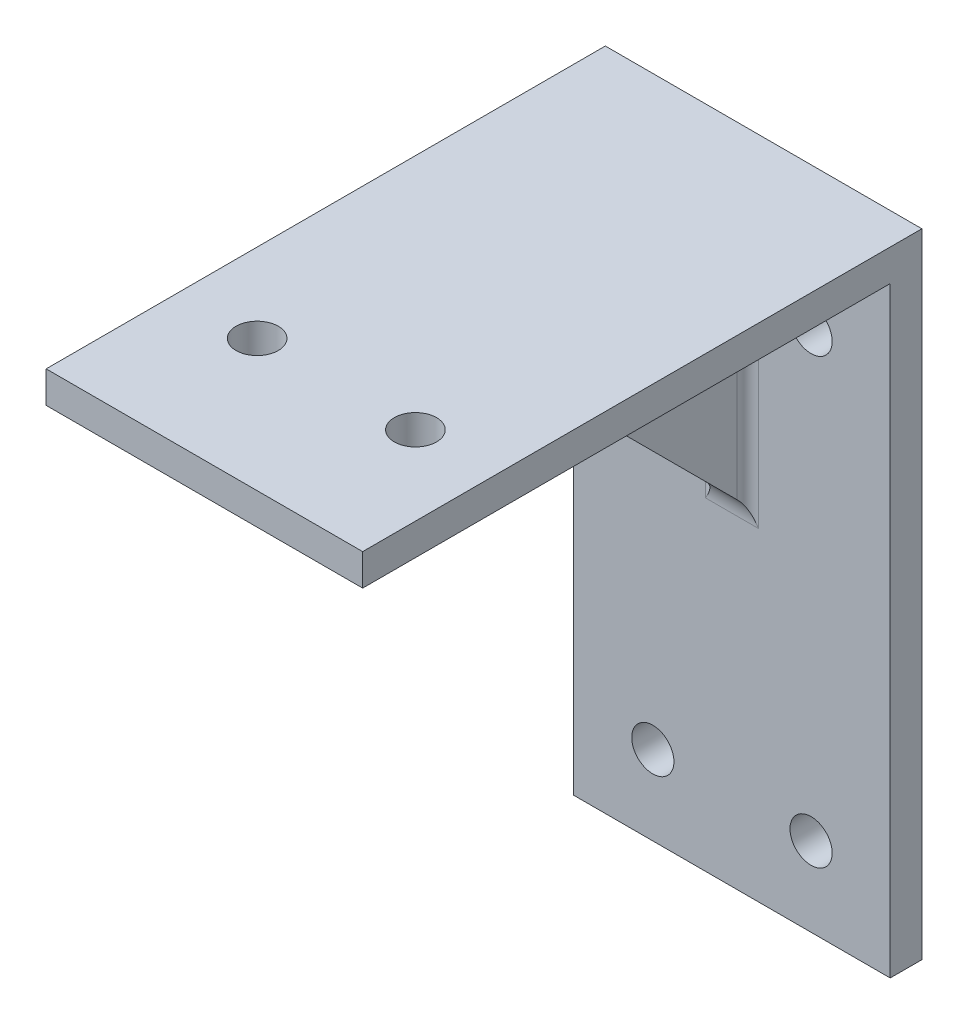
ISO-10303-21;
HEADER;
FILE_DESCRIPTION(('STEP AP214'),'2;1');
FILE_NAME('part.step','',(''),(''),'','','');
FILE_SCHEMA(('AUTOMOTIVE_DESIGN { 1 0 10303 214 1 1 1 1 }'));
ENDSEC;
DATA;
#1=APPLICATION_CONTEXT('core data for automotive mechanical design processes');
#2=APPLICATION_PROTOCOL_DEFINITION('international standard','automotive_design',2000,#1);
#3=PRODUCT_CONTEXT('',#1,'mechanical');
#4=PRODUCT('Part','Part','',(#3));
#5=PRODUCT_RELATED_PRODUCT_CATEGORY('part','',(#4));
#6=PRODUCT_DEFINITION_FORMATION('','',#4);
#7=PRODUCT_DEFINITION_CONTEXT('part definition',#1,'design');
#8=PRODUCT_DEFINITION('design','',#6,#7);
#9=PRODUCT_DEFINITION_SHAPE('','',#8);
#10=(LENGTH_UNIT() NAMED_UNIT(*) SI_UNIT(.MILLI.,.METRE.));
#11=(NAMED_UNIT(*) PLANE_ANGLE_UNIT() SI_UNIT($,.RADIAN.));
#12=(NAMED_UNIT(*) SI_UNIT($,.STERADIAN.) SOLID_ANGLE_UNIT());
#13=UNCERTAINTY_MEASURE_WITH_UNIT(LENGTH_MEASURE(1.E-05),#10,'distance_accuracy_value','');
#14=(GEOMETRIC_REPRESENTATION_CONTEXT(3) GLOBAL_UNCERTAINTY_ASSIGNED_CONTEXT((#13)) GLOBAL_UNIT_ASSIGNED_CONTEXT((#10,
#11,#12)) REPRESENTATION_CONTEXT('',''));
#15=CARTESIAN_POINT('',(0.,0.,0.));
#16=DIRECTION('',(0.,0.,1.));
#17=DIRECTION('',(1.,0.,0.));
#18=AXIS2_PLACEMENT_3D('',#15,#16,#17);
#19=CARTESIAN_POINT('',(0.,0.,6.));
#20=DIRECTION('',(0.,0.,1.));
#21=DIRECTION('',(1.,0.,0.));
#22=AXIS2_PLACEMENT_3D('',#19,#20,#21);
#23=PLANE('',#22);
#24=CARTESIAN_POINT('',(15.,-45.,6.));
#25=DIRECTION('',(0.,0.,1.));
#26=DIRECTION('',(1.,0.,0.));
#27=AXIS2_PLACEMENT_3D('',#24,#25,#26);
#28=CIRCLE('',#27,4.);
#29=CARTESIAN_POINT('',(19.,-45.,6.));
#30=VERTEX_POINT('',#29);
#31=EDGE_CURVE('E4968',#30,#30,#28,.T.);
#32=ORIENTED_EDGE('',*,*,#31,.F.);
#33=EDGE_LOOP('',(#32));
#34=FACE_BOUND('',#33,.T.);
#35=CARTESIAN_POINT('',(-15.,39.,6.));
#36=DIRECTION('',(0.,0.,1.));
#37=DIRECTION('',(1.,0.,0.));
#38=AXIS2_PLACEMENT_3D('',#35,#36,#37);
#39=CIRCLE('',#38,4.);
#40=CARTESIAN_POINT('',(-11.,39.,6.));
#41=VERTEX_POINT('',#40);
#42=EDGE_CURVE('E4970',#41,#41,#39,.T.);
#43=ORIENTED_EDGE('',*,*,#42,.F.);
#44=EDGE_LOOP('',(#43));
#45=FACE_BOUND('',#44,.T.);
#46=CARTESIAN_POINT('',(15.,39.,6.));
#47=DIRECTION('',(0.,0.,1.));
#48=DIRECTION('',(1.,0.,0.));
#49=AXIS2_PLACEMENT_3D('',#46,#47,#48);
#50=CIRCLE('',#49,4.);
#51=CARTESIAN_POINT('',(19.,39.,6.));
#52=VERTEX_POINT('',#51);
#53=EDGE_CURVE('E4872',#52,#52,#50,.T.);
#54=ORIENTED_EDGE('',*,*,#53,.F.);
#55=EDGE_LOOP('',(#54));
#56=FACE_BOUND('',#55,.T.);
#57=CARTESIAN_POINT('',(-15.,-45.,6.));
#58=DIRECTION('',(0.,0.,1.));
#59=DIRECTION('',(1.,0.,0.));
#60=AXIS2_PLACEMENT_3D('',#57,#58,#59);
#61=CIRCLE('',#60,4.);
#62=CARTESIAN_POINT('',(-11.,-45.,6.));
#63=VERTEX_POINT('',#62);
#64=EDGE_CURVE('E4820',#63,#63,#61,.T.);
#65=ORIENTED_EDGE('',*,*,#64,.F.);
#66=EDGE_LOOP('',(#65));
#67=FACE_BOUND('',#66,.T.);
#68=DIRECTION('',(-1.,0.,0.));
#69=VECTOR('',#68,1.);
#70=CARTESIAN_POINT('',(0.,1.30761184457489,6.));
#71=LINE('',#70,#69);
#72=CARTESIAN_POINT('',(5.,1.30761184457489,6.));
#73=VERTEX_POINT('',#72);
#74=CARTESIAN_POINT('',(-5.,1.30761184457489,6.));
#75=VERTEX_POINT('',#74);
#76=EDGE_CURVE('E4870',#73,#75,#71,.T.);
#77=ORIENTED_EDGE('',*,*,#76,.T.);
#78=DIRECTION('',(0.,1.,0.));
#79=VECTOR('',#78,1.);
#80=CARTESIAN_POINT('',(-5.,54.,6.));
#81=LINE('',#80,#79);
#82=CARTESIAN_POINT('',(-5.,54.,6.));
#83=VERTEX_POINT('',#82);
#84=EDGE_CURVE('E4835',#75,#83,#81,.T.);
#85=ORIENTED_EDGE('',*,*,#84,.T.);
#86=DIRECTION('',(-1.,0.,0.));
#87=VECTOR('',#86,1.);
#88=CARTESIAN_POINT('',(30.,54.,6.));
#89=LINE('',#88,#87);
#90=CARTESIAN_POINT('',(-30.,54.,6.));
#91=VERTEX_POINT('',#90);
#92=EDGE_CURVE('E4759',#83,#91,#89,.T.);
#93=ORIENTED_EDGE('',*,*,#92,.T.);
#94=DIRECTION('',(0.,-1.,0.));
#95=VECTOR('',#94,1.);
#96=CARTESIAN_POINT('',(-30.,-60.,6.));
#97=LINE('',#96,#95);
#98=CARTESIAN_POINT('',(-30.,-60.,6.));
#99=VERTEX_POINT('',#98);
#100=EDGE_CURVE('E4746',#91,#99,#97,.T.);
#101=ORIENTED_EDGE('',*,*,#100,.T.);
#102=DIRECTION('',(1.,0.,0.));
#103=VECTOR('',#102,1.);
#104=CARTESIAN_POINT('',(-30.,-60.,6.));
#105=LINE('',#104,#103);
#106=CARTESIAN_POINT('',(30.,-60.,6.));
#107=VERTEX_POINT('',#106);
#108=EDGE_CURVE('E4767',#99,#107,#105,.T.);
#109=ORIENTED_EDGE('',*,*,#108,.T.);
#110=DIRECTION('',(0.,1.,0.));
#111=VECTOR('',#110,1.);
#112=CARTESIAN_POINT('',(30.,-60.,6.));
#113=LINE('',#112,#111);
#114=CARTESIAN_POINT('',(30.,54.,6.));
#115=VERTEX_POINT('',#114);
#116=EDGE_CURVE('E4775',#107,#115,#113,.T.);
#117=ORIENTED_EDGE('',*,*,#116,.T.);
#118=CARTESIAN_POINT('',(5.,54.,6.));
#119=VERTEX_POINT('',#118);
#120=EDGE_CURVE('E4732',#115,#119,#89,.T.);
#121=ORIENTED_EDGE('',*,*,#120,.T.);
#122=DIRECTION('',(0.,1.,0.));
#123=VECTOR('',#122,1.);
#124=CARTESIAN_POINT('',(5.,0.,6.));
#125=LINE('',#124,#123);
#126=EDGE_CURVE('E4805',#119,#73,#125,.F.);
#127=ORIENTED_EDGE('',*,*,#126,.T.);
#128=EDGE_LOOP('',(#77,#85,#93,#101,#109,#117,#121,#127));
#129=FACE_BOUND('',#128,.T.);
#130=ADVANCED_FACE('F4615',(#34,#45,#56,#67,#129),#23,.T.);
#131=CARTESIAN_POINT('',(-30.,60.,6.));
#132=DIRECTION('',(0.,-1.,0.));
#133=DIRECTION('',(1.,0.,0.));
#134=AXIS2_PLACEMENT_3D('',#131,#132,#133);
#135=PLANE('',#134);
#136=CARTESIAN_POINT('',(15.,60.,81.));
#137=DIRECTION('',(0.,1.,0.));
#138=DIRECTION('',(-1.,0.,0.));
#139=AXIS2_PLACEMENT_3D('',#136,#137,#138);
#140=CIRCLE('',#139,4.);
#141=CARTESIAN_POINT('',(11.,60.,81.));
#142=VERTEX_POINT('',#141);
#143=EDGE_CURVE('E4809',#142,#142,#140,.T.);
#144=ORIENTED_EDGE('',*,*,#143,.F.);
#145=EDGE_LOOP('',(#144));
#146=FACE_BOUND('',#145,.T.);
#147=CARTESIAN_POINT('',(-15.,60.,81.));
#148=DIRECTION('',(0.,1.,0.));
#149=DIRECTION('',(-1.,0.,0.));
#150=AXIS2_PLACEMENT_3D('',#147,#148,#149);
#151=CIRCLE('',#150,4.);
#152=CARTESIAN_POINT('',(-19.,60.,81.));
#153=VERTEX_POINT('',#152);
#154=EDGE_CURVE('E4826',#153,#153,#151,.T.);
#155=ORIENTED_EDGE('',*,*,#154,.F.);
#156=EDGE_LOOP('',(#155));
#157=FACE_BOUND('',#156,.T.);
#158=DIRECTION('',(-1.,0.,0.));
#159=VECTOR('',#158,1.);
#160=CARTESIAN_POINT('',(-30.,60.,0.));
#161=LINE('',#160,#159);
#162=CARTESIAN_POINT('',(30.,60.,0.));
#163=VERTEX_POINT('',#162);
#164=CARTESIAN_POINT('',(-30.,60.,0.));
#165=VERTEX_POINT('',#164);
#166=EDGE_CURVE('E4761',#163,#165,#161,.T.);
#167=ORIENTED_EDGE('',*,*,#166,.T.);
#168=DIRECTION('',(0.,0.,-1.));
#169=VECTOR('',#168,1.);
#170=CARTESIAN_POINT('',(-30.,60.,6.));
#171=LINE('',#170,#169);
#172=CARTESIAN_POINT('',(-30.,60.,106.));
#173=VERTEX_POINT('',#172);
#174=EDGE_CURVE('E4798',#173,#165,#171,.T.);
#175=ORIENTED_EDGE('',*,*,#174,.F.);
#176=DIRECTION('',(1.,0.,0.));
#177=VECTOR('',#176,1.);
#178=CARTESIAN_POINT('',(30.,60.,106.));
#179=LINE('',#178,#177);
#180=CARTESIAN_POINT('',(30.,60.,106.));
#181=VERTEX_POINT('',#180);
#182=EDGE_CURVE('E4730',#173,#181,#179,.T.);
#183=ORIENTED_EDGE('',*,*,#182,.T.);
#184=DIRECTION('',(0.,0.,-1.));
#185=VECTOR('',#184,1.);
#186=CARTESIAN_POINT('',(30.,60.,6.));
#187=LINE('',#186,#185);
#188=EDGE_CURVE('E4778',#181,#163,#187,.T.);
#189=ORIENTED_EDGE('',*,*,#188,.T.);
#190=EDGE_LOOP('',(#167,#175,#183,#189));
#191=FACE_BOUND('',#190,.T.);
#192=ADVANCED_FACE('F4915',(#146,#157,#191),#135,.F.);
#193=CARTESIAN_POINT('',(-30.,-60.,6.));
#194=DIRECTION('',(1.,0.,0.));
#195=DIRECTION('',(0.,0.,-1.));
#196=AXIS2_PLACEMENT_3D('',#193,#194,#195);
#197=PLANE('',#196);
#198=DIRECTION('',(0.,-1.,0.));
#199=VECTOR('',#198,1.);
#200=CARTESIAN_POINT('',(-30.,-60.,0.));
#201=LINE('',#200,#199);
#202=CARTESIAN_POINT('',(-30.,-60.,0.));
#203=VERTEX_POINT('',#202);
#204=EDGE_CURVE('E4779',#165,#203,#201,.T.);
#205=ORIENTED_EDGE('',*,*,#204,.T.);
#206=DIRECTION('',(0.,0.,-1.));
#207=VECTOR('',#206,1.);
#208=CARTESIAN_POINT('',(-30.,-60.,6.));
#209=LINE('',#208,#207);
#210=EDGE_CURVE('E4794',#99,#203,#209,.T.);
#211=ORIENTED_EDGE('',*,*,#210,.F.);
#212=ORIENTED_EDGE('',*,*,#100,.F.);
#213=DIRECTION('',(0.,0.,1.));
#214=VECTOR('',#213,1.);
#215=CARTESIAN_POINT('',(-30.,54.,106.));
#216=LINE('',#215,#214);
#217=CARTESIAN_POINT('',(-30.,54.,106.));
#218=VERTEX_POINT('',#217);
#219=EDGE_CURVE('E4739',#91,#218,#216,.T.);
#220=ORIENTED_EDGE('',*,*,#219,.T.);
#221=DIRECTION('',(0.,1.,0.));
#222=VECTOR('',#221,1.);
#223=CARTESIAN_POINT('',(-30.,54.,106.));
#224=LINE('',#223,#222);
#225=EDGE_CURVE('E4721',#218,#173,#224,.T.);
#226=ORIENTED_EDGE('',*,*,#225,.T.);
#227=ORIENTED_EDGE('',*,*,#174,.T.);
#228=EDGE_LOOP('',(#205,#211,#212,#220,#226,#227));
#229=FACE_BOUND('',#228,.T.);
#230=ADVANCED_FACE('F4741',(#229),#197,.F.);
#231=CARTESIAN_POINT('',(-30.,-60.,6.));
#232=DIRECTION('',(0.,1.,0.));
#233=DIRECTION('',(-1.,0.,0.));
#234=AXIS2_PLACEMENT_3D('',#231,#232,#233);
#235=PLANE('',#234);
#236=DIRECTION('',(1.,0.,0.));
#237=VECTOR('',#236,1.);
#238=CARTESIAN_POINT('',(-30.,-60.,0.));
#239=LINE('',#238,#237);
#240=CARTESIAN_POINT('',(30.,-60.,0.));
#241=VERTEX_POINT('',#240);
#242=EDGE_CURVE('E4781',#203,#241,#239,.T.);
#243=ORIENTED_EDGE('',*,*,#242,.T.);
#244=DIRECTION('',(0.,0.,-1.));
#245=VECTOR('',#244,1.);
#246=CARTESIAN_POINT('',(30.,-60.,6.));
#247=LINE('',#246,#245);
#248=EDGE_CURVE('E4791',#107,#241,#247,.T.);
#249=ORIENTED_EDGE('',*,*,#248,.F.);
#250=ORIENTED_EDGE('',*,*,#108,.F.);
#251=ORIENTED_EDGE('',*,*,#210,.T.);
#252=EDGE_LOOP('',(#243,#249,#250,#251));
#253=FACE_BOUND('',#252,.T.);
#254=ADVANCED_FACE('F5008',(#253),#235,.F.);
#255=CARTESIAN_POINT('',(30.,-60.,6.));
#256=DIRECTION('',(-1.,0.,0.));
#257=DIRECTION('',(0.,0.,1.));
#258=AXIS2_PLACEMENT_3D('',#255,#256,#257);
#259=PLANE('',#258);
#260=DIRECTION('',(0.,1.,0.));
#261=VECTOR('',#260,1.);
#262=CARTESIAN_POINT('',(30.,-60.,0.));
#263=LINE('',#262,#261);
#264=EDGE_CURVE('E4768',#241,#163,#263,.T.);
#265=ORIENTED_EDGE('',*,*,#264,.T.);
#266=ORIENTED_EDGE('',*,*,#188,.F.);
#267=DIRECTION('',(0.,1.,0.));
#268=VECTOR('',#267,1.);
#269=CARTESIAN_POINT('',(30.,54.,106.));
#270=LINE('',#269,#268);
#271=CARTESIAN_POINT('',(30.,54.,106.));
#272=VERTEX_POINT('',#271);
#273=EDGE_CURVE('E4735',#272,#181,#270,.T.);
#274=ORIENTED_EDGE('',*,*,#273,.F.);
#275=DIRECTION('',(0.,0.,-1.));
#276=VECTOR('',#275,1.);
#277=CARTESIAN_POINT('',(30.,54.,106.));
#278=LINE('',#277,#276);
#279=EDGE_CURVE('E4742',#272,#115,#278,.T.);
#280=ORIENTED_EDGE('',*,*,#279,.T.);
#281=ORIENTED_EDGE('',*,*,#116,.F.);
#282=ORIENTED_EDGE('',*,*,#248,.T.);
#283=EDGE_LOOP('',(#265,#266,#274,#280,#281,#282));
#284=FACE_BOUND('',#283,.T.);
#285=ADVANCED_FACE('F4999',(#284),#259,.F.);
#286=CARTESIAN_POINT('',(0.,0.,0.));
#287=DIRECTION('',(0.,0.,1.));
#288=DIRECTION('',(1.,0.,0.));
#289=AXIS2_PLACEMENT_3D('',#286,#287,#288);
#290=PLANE('',#289);
#291=CARTESIAN_POINT('',(15.,-45.,0.));
#292=DIRECTION('',(0.,0.,1.));
#293=DIRECTION('',(1.,0.,0.));
#294=AXIS2_PLACEMENT_3D('',#291,#292,#293);
#295=CIRCLE('',#294,4.);
#296=CARTESIAN_POINT('',(19.,-45.,0.));
#297=VERTEX_POINT('',#296);
#298=EDGE_CURVE('E4823',#297,#297,#295,.T.);
#299=ORIENTED_EDGE('',*,*,#298,.T.);
#300=EDGE_LOOP('',(#299));
#301=FACE_BOUND('',#300,.T.);
#302=CARTESIAN_POINT('',(-15.,39.,0.));
#303=DIRECTION('',(0.,0.,1.));
#304=DIRECTION('',(1.,0.,0.));
#305=AXIS2_PLACEMENT_3D('',#302,#303,#304);
#306=CIRCLE('',#305,4.);
#307=CARTESIAN_POINT('',(-11.,39.,0.));
#308=VERTEX_POINT('',#307);
#309=EDGE_CURVE('E4822',#308,#308,#306,.T.);
#310=ORIENTED_EDGE('',*,*,#309,.T.);
#311=EDGE_LOOP('',(#310));
#312=FACE_BOUND('',#311,.T.);
#313=CARTESIAN_POINT('',(15.,39.,0.));
#314=DIRECTION('',(0.,0.,1.));
#315=DIRECTION('',(1.,0.,0.));
#316=AXIS2_PLACEMENT_3D('',#313,#314,#315);
#317=CIRCLE('',#316,4.);
#318=CARTESIAN_POINT('',(19.,39.,0.));
#319=VERTEX_POINT('',#318);
#320=EDGE_CURVE('E4818',#319,#319,#317,.T.);
#321=ORIENTED_EDGE('',*,*,#320,.T.);
#322=EDGE_LOOP('',(#321));
#323=FACE_BOUND('',#322,.T.);
#324=CARTESIAN_POINT('',(-15.,-45.,0.));
#325=DIRECTION('',(0.,0.,1.));
#326=DIRECTION('',(1.,0.,0.));
#327=AXIS2_PLACEMENT_3D('',#324,#325,#326);
#328=CIRCLE('',#327,4.);
#329=CARTESIAN_POINT('',(-11.,-45.,0.));
#330=VERTEX_POINT('',#329);
#331=EDGE_CURVE('E4815',#330,#330,#328,.T.);
#332=ORIENTED_EDGE('',*,*,#331,.T.);
#333=EDGE_LOOP('',(#332));
#334=FACE_BOUND('',#333,.T.);
#335=ORIENTED_EDGE('',*,*,#166,.F.);
#336=ORIENTED_EDGE('',*,*,#264,.F.);
#337=ORIENTED_EDGE('',*,*,#242,.F.);
#338=ORIENTED_EDGE('',*,*,#204,.F.);
#339=EDGE_LOOP('',(#335,#336,#337,#338));
#340=FACE_BOUND('',#339,.T.);
#341=ADVANCED_FACE('F4994',(#301,#312,#323,#334,#340),#290,.F.);
#342=CARTESIAN_POINT('',(30.,54.,106.));
#343=DIRECTION('',(0.,0.,1.));
#344=DIRECTION('',(1.,0.,0.));
#345=AXIS2_PLACEMENT_3D('',#342,#343,#344);
#346=PLANE('',#345);
#347=ORIENTED_EDGE('',*,*,#182,.F.);
#348=ORIENTED_EDGE('',*,*,#225,.F.);
#349=DIRECTION('',(1.,0.,0.));
#350=VECTOR('',#349,1.);
#351=CARTESIAN_POINT('',(30.,54.,106.));
#352=LINE('',#351,#350);
#353=EDGE_CURVE('E4724',#218,#272,#352,.T.);
#354=ORIENTED_EDGE('',*,*,#353,.T.);
#355=ORIENTED_EDGE('',*,*,#273,.T.);
#356=EDGE_LOOP('',(#347,#348,#354,#355));
#357=FACE_BOUND('',#356,.T.);
#358=ADVANCED_FACE('F4723',(#357),#346,.T.);
#359=CARTESIAN_POINT('',(0.,54.,0.));
#360=DIRECTION('',(0.,1.,0.));
#361=DIRECTION('',(-1.,0.,0.));
#362=AXIS2_PLACEMENT_3D('',#359,#360,#361);
#363=PLANE('',#362);
#364=CARTESIAN_POINT('',(15.,54.,81.));
#365=DIRECTION('',(0.,1.,0.));
#366=DIRECTION('',(-1.,0.,0.));
#367=AXIS2_PLACEMENT_3D('',#364,#365,#366);
#368=CIRCLE('',#367,4.);
#369=CARTESIAN_POINT('',(11.,54.,81.));
#370=VERTEX_POINT('',#369);
#371=EDGE_CURVE('E4810',#370,#370,#368,.T.);
#372=ORIENTED_EDGE('',*,*,#371,.T.);
#373=EDGE_LOOP('',(#372));
#374=FACE_BOUND('',#373,.T.);
#375=CARTESIAN_POINT('',(-15.,54.,81.));
#376=DIRECTION('',(0.,1.,0.));
#377=DIRECTION('',(-1.,0.,0.));
#378=AXIS2_PLACEMENT_3D('',#375,#376,#377);
#379=CIRCLE('',#378,4.);
#380=CARTESIAN_POINT('',(-19.,54.,81.));
#381=VERTEX_POINT('',#380);
#382=EDGE_CURVE('E4804',#381,#381,#379,.T.);
#383=ORIENTED_EDGE('',*,*,#382,.T.);
#384=EDGE_LOOP('',(#383));
#385=FACE_BOUND('',#384,.T.);
#386=DIRECTION('',(0.,0.,1.));
#387=VECTOR('',#386,1.);
#388=CARTESIAN_POINT('',(-5.,54.,0.));
#389=LINE('',#388,#387);
#390=CARTESIAN_POINT('',(-5.,54.,58.6923881554251));
#391=VERTEX_POINT('',#390);
#392=EDGE_CURVE('E4631',#83,#391,#389,.T.);
#393=ORIENTED_EDGE('',*,*,#392,.T.);
#394=DIRECTION('',(-1.,0.,0.));
#395=VECTOR('',#394,1.);
#396=CARTESIAN_POINT('',(5.,54.,58.6923881554251));
#397=LINE('',#396,#395);
#398=CARTESIAN_POINT('',(5.,54.,58.6923881554251));
#399=VERTEX_POINT('',#398);
#400=EDGE_CURVE('E4884',#391,#399,#397,.F.);
#401=ORIENTED_EDGE('',*,*,#400,.T.);
#402=DIRECTION('',(0.,0.,1.));
#403=VECTOR('',#402,1.);
#404=CARTESIAN_POINT('',(5.,54.,6.));
#405=LINE('',#404,#403);
#406=EDGE_CURVE('E4643',#399,#119,#405,.F.);
#407=ORIENTED_EDGE('',*,*,#406,.T.);
#408=ORIENTED_EDGE('',*,*,#120,.F.);
#409=ORIENTED_EDGE('',*,*,#279,.F.);
#410=ORIENTED_EDGE('',*,*,#353,.F.);
#411=ORIENTED_EDGE('',*,*,#219,.F.);
#412=ORIENTED_EDGE('',*,*,#92,.F.);
#413=EDGE_LOOP('',(#393,#401,#407,#408,#409,#410,#411,#412));
#414=FACE_BOUND('',#413,.T.);
#415=ADVANCED_FACE('F4740',(#374,#385,#414),#363,.F.);
#416=CARTESIAN_POINT('',(3.,4.,5.99999999999999));
#417=DIRECTION('',(0.,0.707106781186548,-0.707106781186547));
#418=DIRECTION('',(0.,0.707106781186547,0.707106781186548));
#419=AXIS2_PLACEMENT_3D('',#416,#417,#418);
#420=PLANE('',#419);
#421=CARTESIAN_POINT('',(-5.,6.00000000000001,8.));
#422=DIRECTION('',(0.,0.707106781186548,-0.707106781186547));
#423=DIRECTION('',(0.,-0.707106781186547,-0.707106781186548));
#424=AXIS2_PLACEMENT_3D('',#421,#422,#423);
#425=ELLIPSE('',#424,2.82842712474619,2.);
#426=CARTESIAN_POINT('',(-3.,6.00000000000001,8.));
#427=VERTEX_POINT('',#426);
#428=CARTESIAN_POINT('',(-3.00231466456475,5.90380592228745,7.90380592228744));
#429=VERTEX_POINT('',#428);
#430=EDGE_CURVE('E4853',#427,#429,#425,.T.);
#431=ORIENTED_EDGE('',*,*,#430,.T.);
#432=DIRECTION('',(-1.,0.,0.));
#433=VECTOR('',#432,1.);
#434=CARTESIAN_POINT('',(3.,5.90380592228745,7.90380592228744));
#435=LINE('',#434,#433);
#436=CARTESIAN_POINT('',(3.00231466456475,5.90380592228745,7.90380592228744));
#437=VERTEX_POINT('',#436);
#438=EDGE_CURVE('E4885',#429,#437,#435,.F.);
#439=ORIENTED_EDGE('',*,*,#438,.T.);
#440=CARTESIAN_POINT('',(5.,6.00000000000001,8.));
#441=DIRECTION('',(0.,0.707106781186548,-0.707106781186547));
#442=DIRECTION('',(0.,0.707106781186547,0.707106781186548));
#443=AXIS2_PLACEMENT_3D('',#440,#441,#442);
#444=ELLIPSE('',#443,2.82842712474619,2.);
#445=CARTESIAN_POINT('',(3.,6.00000000000001,8.));
#446=VERTEX_POINT('',#445);
#447=EDGE_CURVE('E4860',#437,#446,#444,.T.);
#448=ORIENTED_EDGE('',*,*,#447,.T.);
#449=DIRECTION('',(0.,-0.707106781186547,-0.707106781186548));
#450=VECTOR('',#449,1.);
#451=CARTESIAN_POINT('',(3.,4.,5.99999999999999));
#452=LINE('',#451,#450);
#453=CARTESIAN_POINT('',(3.,52.,54.));
#454=VERTEX_POINT('',#453);
#455=EDGE_CURVE('E4753',#454,#446,#452,.T.);
#456=ORIENTED_EDGE('',*,*,#455,.F.);
#457=CARTESIAN_POINT('',(5.,52.,54.));
#458=DIRECTION('',(0.,0.707106781186548,-0.707106781186547));
#459=DIRECTION('',(0.,-0.707106781186547,-0.707106781186548));
#460=AXIS2_PLACEMENT_3D('',#457,#458,#459);
#461=ELLIPSE('',#460,2.82842712474619,2.);
#462=CARTESIAN_POINT('',(3.00231466456475,52.0961940777126,54.0961940777126));
#463=VERTEX_POINT('',#462);
#464=EDGE_CURVE('E4859',#454,#463,#461,.T.);
#465=ORIENTED_EDGE('',*,*,#464,.T.);
#466=DIRECTION('',(-1.,0.,0.));
#467=VECTOR('',#466,1.);
#468=CARTESIAN_POINT('',(-5.,52.0961940777126,54.0961940777126));
#469=LINE('',#468,#467);
#470=CARTESIAN_POINT('',(-3.00231466456475,52.0961940777126,54.0961940777126));
#471=VERTEX_POINT('',#470);
#472=EDGE_CURVE('E4877',#463,#471,#469,.T.);
#473=ORIENTED_EDGE('',*,*,#472,.T.);
#474=CARTESIAN_POINT('',(-5.,52.,54.));
#475=DIRECTION('',(0.,0.707106781186548,-0.707106781186547));
#476=DIRECTION('',(0.,0.707106781186547,0.707106781186548));
#477=AXIS2_PLACEMENT_3D('',#474,#475,#476);
#478=ELLIPSE('',#477,2.82842712474619,2.);
#479=CARTESIAN_POINT('',(-3.,52.,54.));
#480=VERTEX_POINT('',#479);
#481=EDGE_CURVE('E4863',#471,#480,#478,.T.);
#482=ORIENTED_EDGE('',*,*,#481,.T.);
#483=DIRECTION('',(0.,-0.707106781186547,-0.707106781186548));
#484=VECTOR('',#483,1.);
#485=CARTESIAN_POINT('',(-3.,4.,5.99999999999999));
#486=LINE('',#485,#484);
#487=EDGE_CURVE('E4752',#480,#427,#486,.T.);
#488=ORIENTED_EDGE('',*,*,#487,.T.);
#489=EDGE_LOOP('',(#431,#439,#448,#456,#465,#473,#482,#488));
#490=FACE_BOUND('',#489,.T.);
#491=ADVANCED_FACE('F4947',(#490),#420,.F.);
#492=CARTESIAN_POINT('',(3.,0.,0.));
#493=DIRECTION('',(-1.,0.,0.));
#494=DIRECTION('',(0.,0.,1.));
#495=AXIS2_PLACEMENT_3D('',#492,#493,#494);
#496=PLANE('',#495);
#497=ORIENTED_EDGE('',*,*,#455,.T.);
#498=DIRECTION('',(0.,1.,0.));
#499=VECTOR('',#498,1.);
#500=CARTESIAN_POINT('',(3.,0.,8.));
#501=LINE('',#500,#499);
#502=CARTESIAN_POINT('',(3.,52.,8.));
#503=VERTEX_POINT('',#502);
#504=EDGE_CURVE('E4844',#446,#503,#501,.T.);
#505=ORIENTED_EDGE('',*,*,#504,.T.);
#506=DIRECTION('',(0.,0.,1.));
#507=VECTOR('',#506,1.);
#508=CARTESIAN_POINT('',(3.,52.,56.));
#509=LINE('',#508,#507);
#510=EDGE_CURVE('E4842',#503,#454,#509,.T.);
#511=ORIENTED_EDGE('',*,*,#510,.T.);
#512=EDGE_LOOP('',(#497,#505,#511));
#513=FACE_BOUND('',#512,.T.);
#514=ADVANCED_FACE('F5059',(#513),#496,.F.);
#515=CARTESIAN_POINT('',(-3.,0.,0.));
#516=DIRECTION('',(-1.,0.,0.));
#517=DIRECTION('',(0.,0.,1.));
#518=AXIS2_PLACEMENT_3D('',#515,#516,#517);
#519=PLANE('',#518);
#520=DIRECTION('',(0.,0.,1.));
#521=VECTOR('',#520,1.);
#522=CARTESIAN_POINT('',(-3.,52.,0.));
#523=LINE('',#522,#521);
#524=CARTESIAN_POINT('',(-3.,52.,8.));
#525=VERTEX_POINT('',#524);
#526=EDGE_CURVE('E4838',#480,#525,#523,.F.);
#527=ORIENTED_EDGE('',*,*,#526,.T.);
#528=DIRECTION('',(0.,1.,0.));
#529=VECTOR('',#528,1.);
#530=CARTESIAN_POINT('',(-3.,4.00000000000001,8.));
#531=LINE('',#530,#529);
#532=EDGE_CURVE('E4837',#525,#427,#531,.F.);
#533=ORIENTED_EDGE('',*,*,#532,.T.);
#534=ORIENTED_EDGE('',*,*,#487,.F.);
#535=EDGE_LOOP('',(#527,#533,#534));
#536=FACE_BOUND('',#535,.T.);
#537=ADVANCED_FACE('F5062',(#536),#519,.T.);
#538=CARTESIAN_POINT('',(-15.,-2.00000000000004,81.));
#539=DIRECTION('',(0.,1.,0.));
#540=DIRECTION('',(-1.,0.,0.));
#541=AXIS2_PLACEMENT_3D('',#538,#539,#540);
#542=CYLINDRICAL_SURFACE('',#541,4.);
#543=ORIENTED_EDGE('',*,*,#154,.T.);
#544=EDGE_LOOP('',(#543));
#545=FACE_BOUND('',#544,.T.);
#546=ORIENTED_EDGE('',*,*,#382,.F.);
#547=EDGE_LOOP('',(#546));
#548=FACE_BOUND('',#547,.T.);
#549=ADVANCED_FACE('F5061',(#545,#548),#542,.F.);
#550=CARTESIAN_POINT('',(15.,-2.00000000000004,81.));
#551=DIRECTION('',(0.,1.,0.));
#552=DIRECTION('',(-1.,0.,0.));
#553=AXIS2_PLACEMENT_3D('',#550,#551,#552);
#554=CYLINDRICAL_SURFACE('',#553,4.);
#555=ORIENTED_EDGE('',*,*,#143,.T.);
#556=EDGE_LOOP('',(#555));
#557=FACE_BOUND('',#556,.T.);
#558=ORIENTED_EDGE('',*,*,#371,.F.);
#559=EDGE_LOOP('',(#558));
#560=FACE_BOUND('',#559,.T.);
#561=ADVANCED_FACE('F4991',(#557,#560),#554,.F.);
#562=CARTESIAN_POINT('',(-15.,-45.,-56.));
#563=DIRECTION('',(0.,0.,1.));
#564=DIRECTION('',(1.,0.,0.));
#565=AXIS2_PLACEMENT_3D('',#562,#563,#564);
#566=CYLINDRICAL_SURFACE('',#565,4.);
#567=ORIENTED_EDGE('',*,*,#64,.T.);
#568=EDGE_LOOP('',(#567));
#569=FACE_BOUND('',#568,.T.);
#570=ORIENTED_EDGE('',*,*,#331,.F.);
#571=EDGE_LOOP('',(#570));
#572=FACE_BOUND('',#571,.T.);
#573=ADVANCED_FACE('F4988',(#569,#572),#566,.F.);
#574=CARTESIAN_POINT('',(15.,39.,-56.));
#575=DIRECTION('',(0.,0.,1.));
#576=DIRECTION('',(1.,0.,0.));
#577=AXIS2_PLACEMENT_3D('',#574,#575,#576);
#578=CYLINDRICAL_SURFACE('',#577,4.);
#579=ORIENTED_EDGE('',*,*,#53,.T.);
#580=EDGE_LOOP('',(#579));
#581=FACE_BOUND('',#580,.T.);
#582=ORIENTED_EDGE('',*,*,#320,.F.);
#583=EDGE_LOOP('',(#582));
#584=FACE_BOUND('',#583,.T.);
#585=ADVANCED_FACE('F4979',(#581,#584),#578,.F.);
#586=CARTESIAN_POINT('',(-15.,39.,-56.));
#587=DIRECTION('',(0.,0.,1.));
#588=DIRECTION('',(1.,0.,0.));
#589=AXIS2_PLACEMENT_3D('',#586,#587,#588);
#590=CYLINDRICAL_SURFACE('',#589,4.);
#591=ORIENTED_EDGE('',*,*,#42,.T.);
#592=EDGE_LOOP('',(#591));
#593=FACE_BOUND('',#592,.T.);
#594=ORIENTED_EDGE('',*,*,#309,.F.);
#595=EDGE_LOOP('',(#594));
#596=FACE_BOUND('',#595,.T.);
#597=ADVANCED_FACE('F5073',(#593,#596),#590,.F.);
#598=CARTESIAN_POINT('',(15.,-45.,-56.));
#599=DIRECTION('',(0.,0.,1.));
#600=DIRECTION('',(1.,0.,0.));
#601=AXIS2_PLACEMENT_3D('',#598,#599,#600);
#602=CYLINDRICAL_SURFACE('',#601,4.);
#603=ORIENTED_EDGE('',*,*,#31,.T.);
#604=EDGE_LOOP('',(#603));
#605=FACE_BOUND('',#604,.T.);
#606=ORIENTED_EDGE('',*,*,#298,.F.);
#607=EDGE_LOOP('',(#606));
#608=FACE_BOUND('',#607,.T.);
#609=ADVANCED_FACE('F4916',(#605,#608),#602,.F.);
#610=CARTESIAN_POINT('',(-5.,52.,0.));
#611=DIRECTION('',(0.,0.,1.));
#612=DIRECTION('',(0.,-1.,0.));
#613=AXIS2_PLACEMENT_3D('',#610,#611,#612);
#614=CYLINDRICAL_SURFACE('',#613,2.);
#615=ORIENTED_EDGE('',*,*,#481,.F.);
#616=CARTESIAN_POINT('',(-3.00231466456475,52.0961940777126,54.0961940777126));
#617=CARTESIAN_POINT('',(-3.00622550766288,52.1768093904327,54.1767852322195));
#618=CARTESIAN_POINT('',(-3.01485324704446,52.2550902509856,54.2593295467159));
#619=CARTESIAN_POINT('',(-3.04024068633487,52.4065108835584,54.4275467993372));
#620=CARTESIAN_POINT('',(-3.05698491091134,52.4796601371735,54.5132134978488));
#621=CARTESIAN_POINT('',(-3.09715375266703,52.6200448527975,54.686456847711));
#622=CARTESIAN_POINT('',(-3.12051939078869,52.6873259564187,54.7740105969688));
#623=CARTESIAN_POINT('',(-3.17298210365071,52.8166251180769,54.9513263199935));
#624=CARTESIAN_POINT('',(-3.20208288364523,52.8786397363816,55.0410896883277));
#625=CARTESIAN_POINT('',(-3.28061560204,53.0265333526668,55.2669618938452));
#626=CARTESIAN_POINT('',(-3.33301189005822,53.1091675264163,55.4041729183017));
#627=CARTESIAN_POINT('',(-3.44617672895053,53.2628303761002,55.6815825387026));
#628=CARTESIAN_POINT('',(-3.50694778308981,53.3338555681155,55.8217820172813));
#629=CARTESIAN_POINT('',(-3.63533013010575,53.4649700232388,56.1051819736084));
#630=CARTESIAN_POINT('',(-3.70297613196458,53.5249990236234,56.2483944581597));
#631=CARTESIAN_POINT('',(-3.84329821796242,53.633992972962,56.536499938273));
#632=CARTESIAN_POINT('',(-3.91597376891581,53.6829590923589,56.6813927543505));
#633=CARTESIAN_POINT('',(-4.06882639195489,53.7723249525907,56.9796816697569));
#634=CARTESIAN_POINT('',(-4.1491967713441,53.8121781454475,57.1331425505929));
#635=CARTESIAN_POINT('',(-4.31288293377095,53.8803550186508,57.4410107184033));
#636=CARTESIAN_POINT('',(-4.39619916696534,53.9086769285508,57.5954181470138));
#637=CARTESIAN_POINT('',(-4.64851673848133,53.9765441920554,58.0586967467108));
#638=CARTESIAN_POINT('',(-4.82045979091672,53.9993134435082,58.3687167586952));
#639=CARTESIAN_POINT('',(-4.99478570258509,53.9999948977439,58.6829879385081));
#640=CARTESIAN_POINT('',(-4.99739288442831,53.9999999954146,58.6876881022048));
#641=CARTESIAN_POINT('',(-5.,54.,58.6923881554251));
#642=B_SPLINE_CURVE_WITH_KNOTS('',3,(#616,#617,#618,#619,#620,#621,#622,#623,#624,#625,#626,
#627,#628,#629,#630,#631,#632,#633,#634,#635,#636,#637,#638,#639,#640,#641),.UNSPECIFIED.,.F.,
.F.,(4,2,2,2,2,2,2,2,2,2,2,2,4),(0.,0.341877807460548,0.683106320881668,1.02138610510879,
1.35988515958104,1.86469402857368,2.36965411641518,2.8773037618616,3.38489967324777,
3.91771736692729,4.45061683553605,5.51261671377738,5.52874123652764),.UNSPECIFIED.);
#643=EDGE_CURVE('E4630',#471,#391,#642,.T.);
#644=ORIENTED_EDGE('',*,*,#643,.T.);
#645=ORIENTED_EDGE('',*,*,#392,.F.);
#646=CARTESIAN_POINT('',(-5.,52.,8.));
#647=DIRECTION('',(0.,-0.707106781186547,-0.707106781186547));
#648=DIRECTION('',(0.,-0.707106781186547,0.707106781186547));
#649=AXIS2_PLACEMENT_3D('',#646,#647,#648);
#650=ELLIPSE('',#649,2.82842712474619,2.);
#651=EDGE_CURVE('E4869',#525,#83,#650,.F.);
#652=ORIENTED_EDGE('',*,*,#651,.F.);
#653=ORIENTED_EDGE('',*,*,#526,.F.);
#654=EDGE_LOOP('',(#615,#644,#645,#652,#653));
#655=FACE_BOUND('',#654,.T.);
#656=ADVANCED_FACE('F4909',(#655),#614,.F.);
#657=CARTESIAN_POINT('',(-5.,0.,8.));
#658=DIRECTION('',(0.,-1.,0.));
#659=DIRECTION('',(0.,0.,-1.));
#660=AXIS2_PLACEMENT_3D('',#657,#658,#659);
#661=CYLINDRICAL_SURFACE('',#660,2.);
#662=ORIENTED_EDGE('',*,*,#430,.F.);
#663=ORIENTED_EDGE('',*,*,#532,.F.);
#664=ORIENTED_EDGE('',*,*,#651,.T.);
#665=ORIENTED_EDGE('',*,*,#84,.F.);
#666=CARTESIAN_POINT('',(-3.00231466456475,5.90380592228745,7.90380592228744));
#667=CARTESIAN_POINT('',(-3.00622550766288,5.82321476778048,7.82319060956727));
#668=CARTESIAN_POINT('',(-3.01485324704447,5.74067045328402,7.74490974901439));
#669=CARTESIAN_POINT('',(-3.04024068633489,5.57245320066276,7.59348911644155));
#670=CARTESIAN_POINT('',(-3.05698491091136,5.4867865021511,7.52033986282637));
#671=CARTESIAN_POINT('',(-3.09715375266706,5.31354315228892,7.37995514720236));
#672=CARTESIAN_POINT('',(-3.12051939078872,5.22598940303108,7.31267404358125));
#673=CARTESIAN_POINT('',(-3.17298210365073,5.04867368000649,7.1833748819231));
#674=CARTESIAN_POINT('',(-3.20208288364523,4.95891031167227,7.12136026361838));
#675=CARTESIAN_POINT('',(-3.28061560203999,4.73303810615482,6.97346664733321));
#676=CARTESIAN_POINT('',(-3.3330118900582,4.59582708169833,6.89083247358369));
#677=CARTESIAN_POINT('',(-3.44617672895049,4.31841746129751,6.73716962389983));
#678=CARTESIAN_POINT('',(-3.50694778308977,4.1782179827188,6.66614443188453));
#679=CARTESIAN_POINT('',(-3.6353301301057,3.89481802639171,6.53502997676123));
#680=CARTESIAN_POINT('',(-3.70297613196453,3.75160554184036,6.47500097637663));
#681=CARTESIAN_POINT('',(-3.84329821796241,3.46350006172705,6.36600702703806));
#682=CARTESIAN_POINT('',(-3.91597376891583,3.31860724564957,6.31704090764108));
#683=CARTESIAN_POINT('',(-4.06882639195485,3.02031833024304,6.22767504740928));
#684=CARTESIAN_POINT('',(-4.14919677134396,2.86685744940701,6.18782185455253));
#685=CARTESIAN_POINT('',(-4.3128829337711,2.55898928159681,6.11964498134924));
#686=CARTESIAN_POINT('',(-4.39619916696589,2.40458185298644,6.09132307144924));
#687=CARTESIAN_POINT('',(-4.64851673848027,1.94130325328853,6.02345580794462));
#688=CARTESIAN_POINT('',(-4.82045979091086,1.63128324130152,6.00068655649178));
#689=CARTESIAN_POINT('',(-4.99478570258492,1.31701206149184,6.00000510225605));
#690=CARTESIAN_POINT('',(-4.99739288442822,1.31231189779511,6.00000000458536));
#691=CARTESIAN_POINT('',(-5.,1.30761184457489,6.));
#692=B_SPLINE_CURVE_WITH_KNOTS('',3,(#666,#667,#668,#669,#670,#671,#672,#673,#674,#675,#676,
#677,#678,#679,#680,#681,#682,#683,#684,#685,#686,#687,#688,#689,#690,#691),.UNSPECIFIED.,.F.,
.F.,(4,2,2,2,2,2,2,2,2,2,2,2,4),(0.,0.341877807460644,0.68310632088187,1.02138610510889,
1.35988515958104,1.8646940285736,2.36965411641504,2.87730376186153,3.38489967324777,
3.91771736692731,4.45061683553612,5.5126167137774,5.52874123652765),.UNSPECIFIED.);
#693=EDGE_CURVE('E4886',#75,#429,#692,.F.);
#694=ORIENTED_EDGE('',*,*,#693,.T.);
#695=EDGE_LOOP('',(#662,#663,#664,#665,#694));
#696=FACE_BOUND('',#695,.T.);
#697=ADVANCED_FACE('F4902',(#696),#661,.F.);
#698=CARTESIAN_POINT('',(5.,52.,0.));
#699=DIRECTION('',(0.,0.,-1.));
#700=DIRECTION('',(0.,1.,0.));
#701=AXIS2_PLACEMENT_3D('',#698,#699,#700);
#702=CYLINDRICAL_SURFACE('',#701,2.);
#703=ORIENTED_EDGE('',*,*,#464,.F.);
#704=ORIENTED_EDGE('',*,*,#510,.F.);
#705=CARTESIAN_POINT('',(5.,52.,8.));
#706=DIRECTION('',(0.,0.707106781186547,0.707106781186547));
#707=DIRECTION('',(0.,0.707106781186547,-0.707106781186547));
#708=AXIS2_PLACEMENT_3D('',#705,#706,#707);
#709=ELLIPSE('',#708,2.82842712474619,2.);
#710=EDGE_CURVE('E4875',#119,#503,#709,.T.);
#711=ORIENTED_EDGE('',*,*,#710,.F.);
#712=ORIENTED_EDGE('',*,*,#406,.F.);
#713=CARTESIAN_POINT('',(3.00231466456475,52.0961940777126,54.0961940777126));
#714=CARTESIAN_POINT('',(3.00622550766287,52.1768093904327,54.1767852322195));
#715=CARTESIAN_POINT('',(3.01485324704445,52.2550902509855,54.2593295467158));
#716=CARTESIAN_POINT('',(3.04024068633484,52.4065108835582,54.4275467993369));
#717=CARTESIAN_POINT('',(3.05698491091128,52.4796601371733,54.5132134978485));
#718=CARTESIAN_POINT('',(3.09715375266695,52.6200448527973,54.6864568477107));
#719=CARTESIAN_POINT('',(3.12051939078862,52.6873259564185,54.7740105969686));
#720=CARTESIAN_POINT('',(3.17298210365068,52.8166251180768,54.9513263199933));
#721=CARTESIAN_POINT('',(3.20208288364521,52.8786397363816,55.0410896883277));
#722=CARTESIAN_POINT('',(3.28061560204002,53.0265333526668,55.2669618938453));
#723=CARTESIAN_POINT('',(3.33301189005826,53.1091675264164,55.4041729183018));
#724=CARTESIAN_POINT('',(3.44617672895061,53.2628303761003,55.6815825387028));
#725=CARTESIAN_POINT('',(3.50694778308991,53.3338555681156,55.8217820172815));
#726=CARTESIAN_POINT('',(3.63533013010587,53.4649700232389,56.1051819736086));
#727=CARTESIAN_POINT('',(3.70297613196469,53.5249990236235,56.2483944581599));
#728=CARTESIAN_POINT('',(3.84329821796244,53.633992972962,56.5364999382731));
#729=CARTESIAN_POINT('',(3.91597376891576,53.6829590923589,56.6813927543506));
#730=CARTESIAN_POINT('',(4.06882639195499,53.7723249525907,56.9796816697569));
#731=CARTESIAN_POINT('',(4.14919677134445,53.8121781454475,57.1331425505927));
#732=CARTESIAN_POINT('',(4.31288293377061,53.8803550186508,57.4410107184034));
#733=CARTESIAN_POINT('',(4.39619916696407,53.9086769285508,57.5954181470145));
#734=CARTESIAN_POINT('',(4.64851673848381,53.9765441920554,58.0586967467094));
#735=CARTESIAN_POINT('',(4.82045979093032,53.9993134435082,58.3687167586876));
#736=CARTESIAN_POINT('',(4.99478570258551,53.9999948977439,58.6829879385078));
#737=CARTESIAN_POINT('',(4.99739288442852,53.9999999954146,58.6876881022047));
#738=CARTESIAN_POINT('',(5.,54.,58.6923881554251));
#739=B_SPLINE_CURVE_WITH_KNOTS('',3,(#713,#714,#715,#716,#717,#718,#719,#720,#721,#722,#723,
#724,#725,#726,#727,#728,#729,#730,#731,#732,#733,#734,#735,#736,#737,#738),.UNSPECIFIED.,.F.,
.F.,(4,2,2,2,2,2,2,2,2,2,2,2,4),(0.,0.341877807460326,0.683106320881213,1.02138610510856,
1.35988515958105,1.86469402857386,2.36965411641552,2.87730376186174,3.38489967324779,
3.9177173669273,4.45061683553598,5.51261671377739,5.52874123652764),.UNSPECIFIED.);
#740=EDGE_CURVE('E12',#399,#463,#739,.F.);
#741=ORIENTED_EDGE('',*,*,#740,.T.);
#742=EDGE_LOOP('',(#703,#704,#711,#712,#741));
#743=FACE_BOUND('',#742,.T.);
#744=ADVANCED_FACE('F4910',(#743),#702,.F.);
#745=CARTESIAN_POINT('',(5.,0.,8.));
#746=DIRECTION('',(0.,1.,0.));
#747=DIRECTION('',(0.,0.,1.));
#748=AXIS2_PLACEMENT_3D('',#745,#746,#747);
#749=CYLINDRICAL_SURFACE('',#748,2.);
#750=ORIENTED_EDGE('',*,*,#447,.F.);
#751=CARTESIAN_POINT('',(3.00231466456475,5.90380592228745,7.90380592228744));
#752=CARTESIAN_POINT('',(3.00622550766288,5.82321476778048,7.82319060956727));
#753=CARTESIAN_POINT('',(3.01485324704447,5.74067045328402,7.74490974901439));
#754=CARTESIAN_POINT('',(3.04024068633489,5.57245320066276,7.59348911644155));
#755=CARTESIAN_POINT('',(3.05698491091136,5.4867865021511,7.52033986282637));
#756=CARTESIAN_POINT('',(3.09715375266706,5.31354315228892,7.37995514720236));
#757=CARTESIAN_POINT('',(3.12051939078872,5.22598940303108,7.31267404358125));
#758=CARTESIAN_POINT('',(3.17298210365073,5.04867368000649,7.1833748819231));
#759=CARTESIAN_POINT('',(3.20208288364523,4.95891031167227,7.12136026361838));
#760=CARTESIAN_POINT('',(3.28061560203999,4.73303810615482,6.97346664733321));
#761=CARTESIAN_POINT('',(3.3330118900582,4.59582708169833,6.89083247358369));
#762=CARTESIAN_POINT('',(3.44617672895049,4.31841746129751,6.73716962389983));
#763=CARTESIAN_POINT('',(3.50694778308977,4.1782179827188,6.66614443188453));
#764=CARTESIAN_POINT('',(3.6353301301057,3.89481802639171,6.53502997676123));
#765=CARTESIAN_POINT('',(3.70297613196453,3.75160554184036,6.47500097637663));
#766=CARTESIAN_POINT('',(3.84329821796241,3.46350006172705,6.36600702703806));
#767=CARTESIAN_POINT('',(3.91597376891583,3.31860724564957,6.31704090764108));
#768=CARTESIAN_POINT('',(4.06882639195485,3.02031833024304,6.22767504740928));
#769=CARTESIAN_POINT('',(4.14919677134396,2.86685744940701,6.18782185455253));
#770=CARTESIAN_POINT('',(4.3128829337711,2.55898928159681,6.11964498134924));
#771=CARTESIAN_POINT('',(4.39619916696589,2.40458185298644,6.09132307144924));
#772=CARTESIAN_POINT('',(4.64851673848027,1.94130325328853,6.02345580794462));
#773=CARTESIAN_POINT('',(4.82045979091086,1.63128324130152,6.00068655649178));
#774=CARTESIAN_POINT('',(4.99478570258492,1.31701206149184,6.00000510225605));
#775=CARTESIAN_POINT('',(4.99739288442822,1.31231189779511,6.00000000458536));
#776=CARTESIAN_POINT('',(5.,1.30761184457489,6.));
#777=B_SPLINE_CURVE_WITH_KNOTS('',3,(#751,#752,#753,#754,#755,#756,#757,#758,#759,#760,#761,
#762,#763,#764,#765,#766,#767,#768,#769,#770,#771,#772,#773,#774,#775,#776),.UNSPECIFIED.,.F.,
.F.,(4,2,2,2,2,2,2,2,2,2,2,2,4),(0.,0.341877807460644,0.68310632088187,1.02138610510889,
1.35988515958104,1.8646940285736,2.36965411641504,2.87730376186153,3.38489967324777,
3.91771736692731,4.45061683553612,5.5126167137774,5.52874123652765),.UNSPECIFIED.);
#778=EDGE_CURVE('E4896',#437,#73,#777,.T.);
#779=ORIENTED_EDGE('',*,*,#778,.T.);
#780=ORIENTED_EDGE('',*,*,#126,.F.);
#781=ORIENTED_EDGE('',*,*,#710,.T.);
#782=ORIENTED_EDGE('',*,*,#504,.F.);
#783=EDGE_LOOP('',(#750,#779,#780,#781,#782));
#784=FACE_BOUND('',#783,.T.);
#785=ADVANCED_FACE('F4918',(#784),#749,.F.);
#786=CARTESIAN_POINT('',(0.,1.30761184457489,12.5));
#787=DIRECTION('',(-1.,0.,0.));
#788=DIRECTION('',(0.,0.,1.));
#789=AXIS2_PLACEMENT_3D('',#786,#787,#788);
#790=CYLINDRICAL_SURFACE('',#789,6.5);
#791=ORIENTED_EDGE('',*,*,#778,.F.);
#792=ORIENTED_EDGE('',*,*,#438,.F.);
#793=ORIENTED_EDGE('',*,*,#693,.F.);
#794=ORIENTED_EDGE('',*,*,#76,.F.);
#795=EDGE_LOOP('',(#791,#792,#793,#794));
#796=FACE_BOUND('',#795,.T.);
#797=ADVANCED_FACE('F4905',(#796),#790,.F.);
#798=CARTESIAN_POINT('',(2.99999999999998,47.5,58.6923881554251));
#799=DIRECTION('',(1.,0.,0.));
#800=DIRECTION('',(0.,0.,-1.));
#801=AXIS2_PLACEMENT_3D('',#798,#799,#800);
#802=CYLINDRICAL_SURFACE('',#801,6.5);
#803=ORIENTED_EDGE('',*,*,#740,.F.);
#804=ORIENTED_EDGE('',*,*,#400,.F.);
#805=ORIENTED_EDGE('',*,*,#643,.F.);
#806=ORIENTED_EDGE('',*,*,#472,.F.);
#807=EDGE_LOOP('',(#803,#804,#805,#806));
#808=FACE_BOUND('',#807,.T.);
#809=ADVANCED_FACE('F4611',(#808),#802,.F.);
#810=CLOSED_SHELL('',(#130,#192,#230,#254,#285,#341,#358,#415,#491,#514,#537,#549,#561,#573,
#585,#597,#609,#656,#697,#744,#785,#797,#809));
#811=MANIFOLD_SOLID_BREP('B2',#810);
#812=ADVANCED_BREP_SHAPE_REPRESENTATION('',(#18,#811),#14);
#813=SHAPE_DEFINITION_REPRESENTATION(#9,#812);
ENDSEC;
END-ISO-10303-21;
